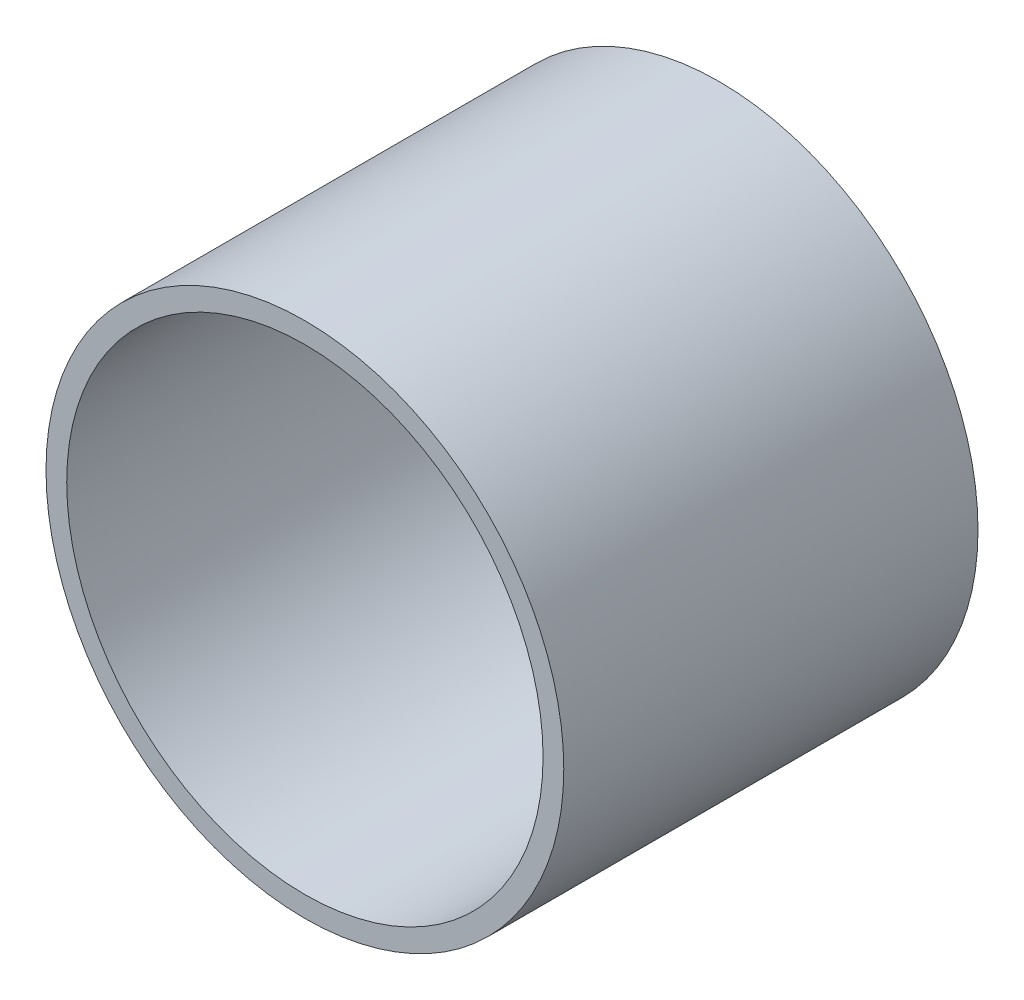
ISO-10303-21;
HEADER;
FILE_DESCRIPTION(('STEP AP214'),'2;1');
FILE_NAME('part.step','',(''),(''),'','','');
FILE_SCHEMA(('AUTOMOTIVE_DESIGN { 1 0 10303 214 1 1 1 1 }'));
ENDSEC;
DATA;
#1=APPLICATION_CONTEXT('core data for automotive mechanical design processes');
#2=APPLICATION_PROTOCOL_DEFINITION('international standard','automotive_design',2000,#1);
#3=PRODUCT_CONTEXT('',#1,'mechanical');
#4=PRODUCT('Part','Part','',(#3));
#5=PRODUCT_RELATED_PRODUCT_CATEGORY('part','',(#4));
#6=PRODUCT_DEFINITION_FORMATION('','',#4);
#7=PRODUCT_DEFINITION_CONTEXT('part definition',#1,'design');
#8=PRODUCT_DEFINITION('design','',#6,#7);
#9=PRODUCT_DEFINITION_SHAPE('','',#8);
#10=(LENGTH_UNIT() NAMED_UNIT(*) SI_UNIT(.MILLI.,.METRE.));
#11=(NAMED_UNIT(*) PLANE_ANGLE_UNIT() SI_UNIT($,.RADIAN.));
#12=(NAMED_UNIT(*) SI_UNIT($,.STERADIAN.) SOLID_ANGLE_UNIT());
#13=UNCERTAINTY_MEASURE_WITH_UNIT(LENGTH_MEASURE(1.E-05),#10,'distance_accuracy_value','');
#14=(GEOMETRIC_REPRESENTATION_CONTEXT(3) GLOBAL_UNCERTAINTY_ASSIGNED_CONTEXT((#13)) GLOBAL_UNIT_ASSIGNED_CONTEXT((#10,
#11,#12)) REPRESENTATION_CONTEXT('',''));
#15=CARTESIAN_POINT('',(0.,0.,0.));
#16=DIRECTION('',(0.,0.,1.));
#17=DIRECTION('',(1.,0.,0.));
#18=AXIS2_PLACEMENT_3D('',#15,#16,#17);
#19=CARTESIAN_POINT('',(0.,0.,6.35));
#20=DIRECTION('',(0.,0.,-1.));
#21=DIRECTION('',(-1.,0.,0.));
#22=AXIS2_PLACEMENT_3D('',#19,#20,#21);
#23=CYLINDRICAL_SURFACE('',#22,3.96875);
#24=CARTESIAN_POINT('',(0.,0.,6.35));
#25=DIRECTION('',(0.,0.,1.));
#26=DIRECTION('',(1.,0.,0.));
#27=AXIS2_PLACEMENT_3D('',#24,#25,#26);
#28=CIRCLE('',#27,3.96875);
#29=CARTESIAN_POINT('',(3.96875,0.,6.35));
#30=VERTEX_POINT('',#29);
#31=EDGE_CURVE('E10',#30,#30,#28,.T.);
#32=ORIENTED_EDGE('',*,*,#31,.F.);
#33=EDGE_LOOP('',(#32));
#34=FACE_BOUND('',#33,.T.);
#35=CARTESIAN_POINT('',(0.,0.,0.));
#36=DIRECTION('',(0.,0.,1.));
#37=DIRECTION('',(1.,0.,0.));
#38=AXIS2_PLACEMENT_3D('',#35,#36,#37);
#39=CIRCLE('',#38,3.96875);
#40=CARTESIAN_POINT('',(3.96875,0.,0.));
#41=VERTEX_POINT('',#40);
#42=EDGE_CURVE('E35',#41,#41,#39,.T.);
#43=ORIENTED_EDGE('',*,*,#42,.T.);
#44=EDGE_LOOP('',(#43));
#45=FACE_BOUND('',#44,.T.);
#46=ADVANCED_FACE('F32',(#34,#45),#23,.T.);
#47=CARTESIAN_POINT('',(0.,0.,6.35));
#48=DIRECTION('',(0.,0.,1.));
#49=DIRECTION('',(1.,0.,0.));
#50=AXIS2_PLACEMENT_3D('',#47,#48,#49);
#51=PLANE('',#50);
#52=CARTESIAN_POINT('',(0.,0.,6.35));
#53=DIRECTION('',(0.,0.,1.));
#54=DIRECTION('',(1.,0.,0.));
#55=AXIS2_PLACEMENT_3D('',#52,#53,#54);
#56=CIRCLE('',#55,3.65125);
#57=CARTESIAN_POINT('',(3.65125,0.,6.35));
#58=VERTEX_POINT('',#57);
#59=EDGE_CURVE('E42',#58,#58,#56,.T.);
#60=ORIENTED_EDGE('',*,*,#59,.F.);
#61=EDGE_LOOP('',(#60));
#62=FACE_BOUND('',#61,.T.);
#63=ORIENTED_EDGE('',*,*,#31,.T.);
#64=EDGE_LOOP('',(#63));
#65=FACE_BOUND('',#64,.T.);
#66=ADVANCED_FACE('F53',(#62,#65),#51,.T.);
#67=CARTESIAN_POINT('',(0.,0.,0.));
#68=DIRECTION('',(0.,0.,1.));
#69=DIRECTION('',(1.,0.,0.));
#70=AXIS2_PLACEMENT_3D('',#67,#68,#69);
#71=PLANE('',#70);
#72=CARTESIAN_POINT('',(0.,0.,0.));
#73=DIRECTION('',(0.,0.,1.));
#74=DIRECTION('',(1.,0.,0.));
#75=AXIS2_PLACEMENT_3D('',#72,#73,#74);
#76=CIRCLE('',#75,3.65125);
#77=CARTESIAN_POINT('',(3.65125,0.,0.));
#78=VERTEX_POINT('',#77);
#79=EDGE_CURVE('E44',#78,#78,#76,.T.);
#80=ORIENTED_EDGE('',*,*,#79,.T.);
#81=EDGE_LOOP('',(#80));
#82=FACE_BOUND('',#81,.T.);
#83=ORIENTED_EDGE('',*,*,#42,.F.);
#84=EDGE_LOOP('',(#83));
#85=FACE_BOUND('',#84,.T.);
#86=ADVANCED_FACE('F55',(#82,#85),#71,.F.);
#87=CARTESIAN_POINT('',(0.,0.,6.35));
#88=DIRECTION('',(0.,0.,-1.));
#89=DIRECTION('',(-1.,0.,0.));
#90=AXIS2_PLACEMENT_3D('',#87,#88,#89);
#91=CYLINDRICAL_SURFACE('',#90,3.65125);
#92=ORIENTED_EDGE('',*,*,#59,.T.);
#93=EDGE_LOOP('',(#92));
#94=FACE_BOUND('',#93,.T.);
#95=ORIENTED_EDGE('',*,*,#79,.F.);
#96=EDGE_LOOP('',(#95));
#97=FACE_BOUND('',#96,.T.);
#98=ADVANCED_FACE('F50',(#94,#97),#91,.F.);
#99=CLOSED_SHELL('',(#46,#66,#86,#98));
#100=MANIFOLD_SOLID_BREP('B2',#99);
#101=ADVANCED_BREP_SHAPE_REPRESENTATION('',(#18,#100),#14);
#102=SHAPE_DEFINITION_REPRESENTATION(#9,#101);
ENDSEC;
END-ISO-10303-21;
